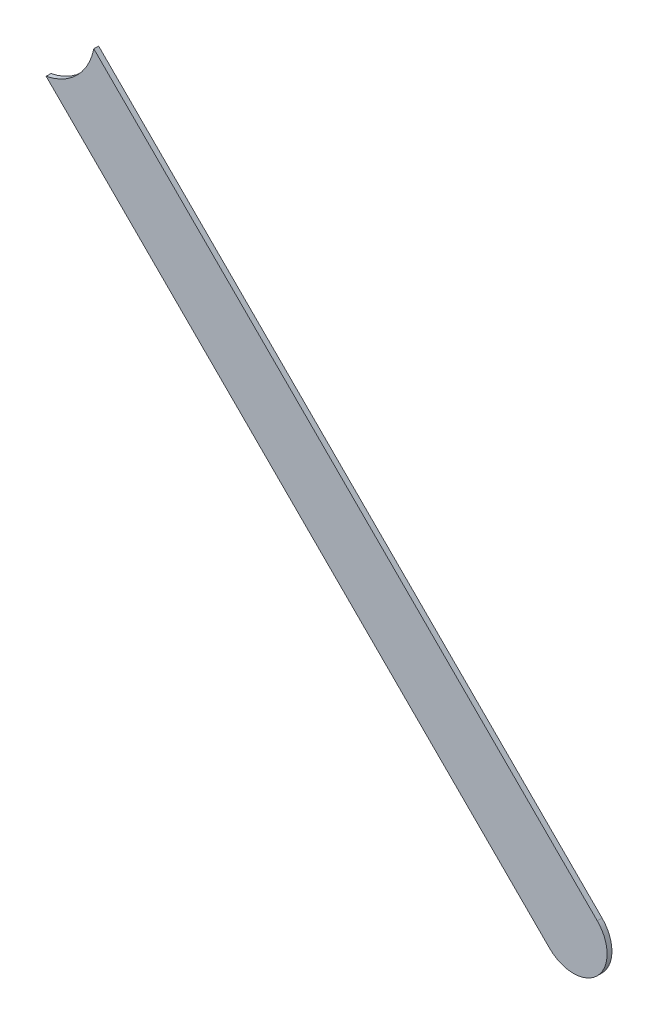
ISO-10303-21;
HEADER;
FILE_DESCRIPTION(('STEP AP214'),'2;1');
FILE_NAME('part.step','',(''),(''),'','','');
FILE_SCHEMA(('AUTOMOTIVE_DESIGN { 1 0 10303 214 1 1 1 1 }'));
ENDSEC;
DATA;
#1=APPLICATION_CONTEXT('core data for automotive mechanical design processes');
#2=APPLICATION_PROTOCOL_DEFINITION('international standard','automotive_design',2000,#1);
#3=PRODUCT_CONTEXT('',#1,'mechanical');
#4=PRODUCT('Part','Part','',(#3));
#5=PRODUCT_RELATED_PRODUCT_CATEGORY('part','',(#4));
#6=PRODUCT_DEFINITION_FORMATION('','',#4);
#7=PRODUCT_DEFINITION_CONTEXT('part definition',#1,'design');
#8=PRODUCT_DEFINITION('design','',#6,#7);
#9=PRODUCT_DEFINITION_SHAPE('','',#8);
#10=(LENGTH_UNIT() NAMED_UNIT(*) SI_UNIT(.MILLI.,.METRE.));
#11=(NAMED_UNIT(*) PLANE_ANGLE_UNIT() SI_UNIT($,.RADIAN.));
#12=(NAMED_UNIT(*) SI_UNIT($,.STERADIAN.) SOLID_ANGLE_UNIT());
#13=UNCERTAINTY_MEASURE_WITH_UNIT(LENGTH_MEASURE(1.E-05),#10,'distance_accuracy_value','');
#14=(GEOMETRIC_REPRESENTATION_CONTEXT(3) GLOBAL_UNCERTAINTY_ASSIGNED_CONTEXT((#13)) GLOBAL_UNIT_ASSIGNED_CONTEXT((#10,
#11,#12)) REPRESENTATION_CONTEXT('',''));
#15=CARTESIAN_POINT('',(0.,0.,0.));
#16=DIRECTION('',(0.,0.,1.));
#17=DIRECTION('',(1.,0.,0.));
#18=AXIS2_PLACEMENT_3D('',#15,#16,#17);
#19=CARTESIAN_POINT('',(43.5478077963948,62.1586254436052,0.));
#20=DIRECTION('',(0.707106781186548,0.707106781186547,0.));
#21=DIRECTION('',(0.707106781186547,-0.707106781186548,0.));
#22=AXIS2_PLACEMENT_3D('',#19,#20,#21);
#23=PLANE('',#22);
#24=DIRECTION('',(0.707106781186547,-0.707106781186548,0.));
#25=VECTOR('',#24,1.);
#26=CARTESIAN_POINT('',(43.28323322,62.42320002,0.03556));
#27=LINE('',#26,#25);
#28=CARTESIAN_POINT('',(43.5478077963948,62.1586254436052,0.03556));
#29=VERTEX_POINT('',#28);
#30=CARTESIAN_POINT('',(47.28322522,58.42320802,0.03556));
#31=VERTEX_POINT('',#30);
#32=EDGE_CURVE('E11',#29,#31,#27,.T.);
#33=ORIENTED_EDGE('',*,*,#32,.F.);
#34=DIRECTION('',(0.,0.,1.));
#35=VECTOR('',#34,1.);
#36=CARTESIAN_POINT('',(43.5478077963948,62.1586254436052,0.));
#37=LINE('',#36,#35);
#38=CARTESIAN_POINT('',(43.5478077963948,62.1586254436052,0.));
#39=VERTEX_POINT('',#38);
#40=EDGE_CURVE('E24',#39,#29,#37,.T.);
#41=ORIENTED_EDGE('',*,*,#40,.F.);
#42=DIRECTION('',(0.707106781186547,-0.707106781186548,0.));
#43=VECTOR('',#42,1.);
#44=CARTESIAN_POINT('',(43.28323322,62.42320002,0.));
#45=LINE('',#44,#43);
#46=CARTESIAN_POINT('',(47.28322522,58.42320802,0.));
#47=VERTEX_POINT('',#46);
#48=EDGE_CURVE('E75',#39,#47,#45,.T.);
#49=ORIENTED_EDGE('',*,*,#48,.T.);
#50=DIRECTION('',(0.,0.,1.));
#51=VECTOR('',#50,1.);
#52=CARTESIAN_POINT('',(47.28322522,58.42320802,0.));
#53=LINE('',#52,#51);
#54=EDGE_CURVE('E37',#47,#31,#53,.T.);
#55=ORIENTED_EDGE('',*,*,#54,.T.);
#56=EDGE_LOOP('',(#33,#41,#49,#55));
#57=FACE_BOUND('',#56,.T.);
#58=ADVANCED_FACE('F17',(#57),#23,.F.);
#59=CARTESIAN_POINT('',(47.4600016,58.5999844,0.));
#60=DIRECTION('',(0.,0.,-1.));
#61=DIRECTION('',(-0.707106781186548,-0.707106781186548,0.));
#62=AXIS2_PLACEMENT_3D('',#59,#60,#61);
#63=CYLINDRICAL_SURFACE('',#62,0.24999955410322);
#64=CARTESIAN_POINT('',(47.4600016,58.5999844,0.03556));
#65=DIRECTION('',(0.,0.,1.));
#66=DIRECTION('',(-0.707106781186548,-0.707106781186548,0.));
#67=AXIS2_PLACEMENT_3D('',#64,#65,#66);
#68=CIRCLE('',#67,0.24999955410322);
#69=CARTESIAN_POINT('',(47.63677798,58.77676078,0.03556));
#70=VERTEX_POINT('',#69);
#71=EDGE_CURVE('E83',#31,#70,#68,.T.);
#72=ORIENTED_EDGE('',*,*,#71,.F.);
#73=ORIENTED_EDGE('',*,*,#54,.F.);
#74=CARTESIAN_POINT('',(47.4600016,58.5999844,0.));
#75=DIRECTION('',(0.,0.,1.));
#76=DIRECTION('',(-0.707106781186548,-0.707106781186548,0.));
#77=AXIS2_PLACEMENT_3D('',#74,#75,#76);
#78=CIRCLE('',#77,0.24999955410322);
#79=CARTESIAN_POINT('',(47.63677798,58.77676078,0.));
#80=VERTEX_POINT('',#79);
#81=EDGE_CURVE('E81',#47,#80,#78,.T.);
#82=ORIENTED_EDGE('',*,*,#81,.T.);
#83=DIRECTION('',(0.,0.,1.));
#84=VECTOR('',#83,1.);
#85=CARTESIAN_POINT('',(47.63677798,58.77676078,0.));
#86=LINE('',#85,#84);
#87=EDGE_CURVE('E67',#80,#70,#86,.T.);
#88=ORIENTED_EDGE('',*,*,#87,.T.);
#89=EDGE_LOOP('',(#72,#73,#82,#88));
#90=FACE_BOUND('',#89,.T.);
#91=ADVANCED_FACE('F89',(#90),#63,.T.);
#92=CARTESIAN_POINT('',(47.63677798,58.77676078,0.));
#93=DIRECTION('',(-0.707106781186548,-0.707106781186548,0.));
#94=DIRECTION('',(-0.707106781186548,0.707106781186548,0.));
#95=AXIS2_PLACEMENT_3D('',#92,#93,#94);
#96=PLANE('',#95);
#97=DIRECTION('',(-0.707106781186548,0.707106781186548,0.));
#98=VECTOR('',#97,1.);
#99=CARTESIAN_POINT('',(47.63677798,58.77676078,0.03556));
#100=LINE('',#99,#98);
#101=CARTESIAN_POINT('',(43.9013605563948,62.5121782036052,0.03556));
#102=VERTEX_POINT('',#101);
#103=EDGE_CURVE('E71',#70,#102,#100,.T.);
#104=ORIENTED_EDGE('',*,*,#103,.F.);
#105=ORIENTED_EDGE('',*,*,#87,.F.);
#106=DIRECTION('',(-0.707106781186548,0.707106781186548,0.));
#107=VECTOR('',#106,1.);
#108=CARTESIAN_POINT('',(47.63677798,58.77676078,0.));
#109=LINE('',#108,#107);
#110=CARTESIAN_POINT('',(43.9013605563948,62.5121782036052,0.));
#111=VERTEX_POINT('',#110);
#112=EDGE_CURVE('E63',#80,#111,#109,.T.);
#113=ORIENTED_EDGE('',*,*,#112,.T.);
#114=DIRECTION('',(0.,0.,1.));
#115=VECTOR('',#114,1.);
#116=CARTESIAN_POINT('',(43.9013605563948,62.5121782036052,0.));
#117=LINE('',#116,#115);
#118=EDGE_CURVE('E53',#111,#102,#117,.T.);
#119=ORIENTED_EDGE('',*,*,#118,.T.);
#120=EDGE_LOOP('',(#104,#105,#113,#119));
#121=FACE_BOUND('',#120,.T.);
#122=ADVANCED_FACE('F66',(#121),#96,.F.);
#123=CARTESIAN_POINT('',(43.4600096,62.5999764,0.));
#124=DIRECTION('',(0.,0.,-1.));
#125=DIRECTION('',(1.,0.,0.));
#126=AXIS2_PLACEMENT_3D('',#123,#124,#125);
#127=CYLINDRICAL_SURFACE('',#126,0.4499991);
#128=ORIENTED_EDGE('',*,*,#40,.T.);
#129=CARTESIAN_POINT('',(43.4600096,62.5999764,0.03556));
#130=DIRECTION('',(0.,0.,1.));
#131=DIRECTION('',(1.,0.,0.));
#132=AXIS2_PLACEMENT_3D('',#129,#130,#131);
#133=CIRCLE('',#132,0.4499991);
#134=EDGE_CURVE('E59',#29,#102,#133,.T.);
#135=ORIENTED_EDGE('',*,*,#134,.T.);
#136=ORIENTED_EDGE('',*,*,#118,.F.);
#137=CARTESIAN_POINT('',(43.4600096,62.5999764,0.));
#138=DIRECTION('',(0.,0.,1.));
#139=DIRECTION('',(1.,0.,0.));
#140=AXIS2_PLACEMENT_3D('',#137,#138,#139);
#141=CIRCLE('',#140,0.4499991);
#142=EDGE_CURVE('E57',#39,#111,#141,.T.);
#143=ORIENTED_EDGE('',*,*,#142,.F.);
#144=EDGE_LOOP('',(#128,#135,#136,#143));
#145=FACE_BOUND('',#144,.T.);
#146=ADVANCED_FACE('F55',(#145),#127,.F.);
#147=CARTESIAN_POINT('',(43.28323322,62.42320002,0.));
#148=DIRECTION('',(0.,0.,-1.));
#149=DIRECTION('',(-1.,0.,0.));
#150=AXIS2_PLACEMENT_3D('',#147,#148,#149);
#151=PLANE('',#150);
#152=ORIENTED_EDGE('',*,*,#48,.F.);
#153=ORIENTED_EDGE('',*,*,#142,.T.);
#154=ORIENTED_EDGE('',*,*,#112,.F.);
#155=ORIENTED_EDGE('',*,*,#81,.F.);
#156=EDGE_LOOP('',(#152,#153,#154,#155));
#157=FACE_BOUND('',#156,.T.);
#158=ADVANCED_FACE('F74',(#157),#151,.T.);
#159=CARTESIAN_POINT('',(43.28323322,62.42320002,0.03556));
#160=DIRECTION('',(0.,0.,-1.));
#161=DIRECTION('',(-1.,0.,0.));
#162=AXIS2_PLACEMENT_3D('',#159,#160,#161);
#163=PLANE('',#162);
#164=ORIENTED_EDGE('',*,*,#134,.F.);
#165=ORIENTED_EDGE('',*,*,#32,.T.);
#166=ORIENTED_EDGE('',*,*,#71,.T.);
#167=ORIENTED_EDGE('',*,*,#103,.T.);
#168=EDGE_LOOP('',(#164,#165,#166,#167));
#169=FACE_BOUND('',#168,.T.);
#170=ADVANCED_FACE('F91',(#169),#163,.F.);
#171=CLOSED_SHELL('',(#58,#91,#122,#146,#158,#170));
#172=MANIFOLD_SOLID_BREP('B1',#171);
#173=ADVANCED_BREP_SHAPE_REPRESENTATION('',(#18,#172),#14);
#174=SHAPE_DEFINITION_REPRESENTATION(#9,#173);
ENDSEC;
END-ISO-10303-21;
